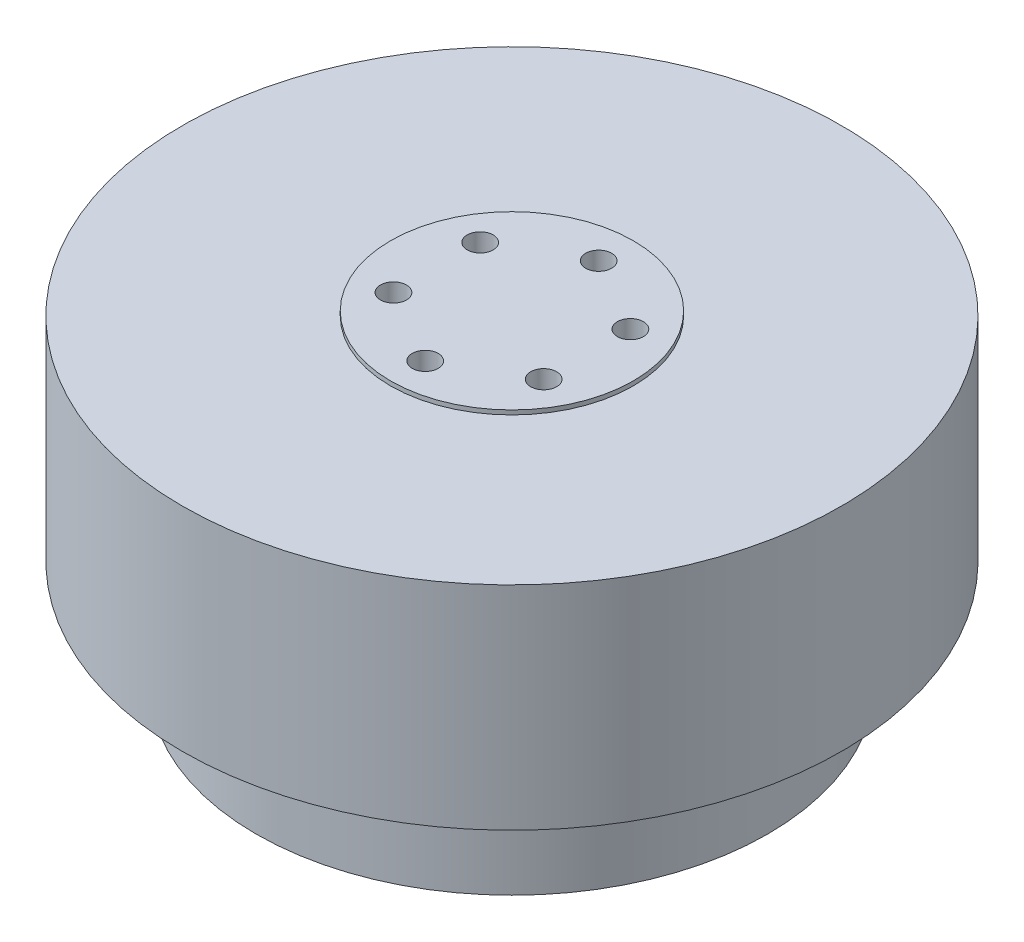
ISO-10303-21;
HEADER;
FILE_DESCRIPTION(('STEP AP214'),'2;1');
FILE_NAME('part.step','',(''),(''),'','','');
FILE_SCHEMA(('AUTOMOTIVE_DESIGN { 1 0 10303 214 1 1 1 1 }'));
ENDSEC;
DATA;
#1=APPLICATION_CONTEXT('core data for automotive mechanical design processes');
#2=APPLICATION_PROTOCOL_DEFINITION('international standard','automotive_design',2000,#1);
#3=PRODUCT_CONTEXT('',#1,'mechanical');
#4=PRODUCT('Part','Part','',(#3));
#5=PRODUCT_RELATED_PRODUCT_CATEGORY('part','',(#4));
#6=PRODUCT_DEFINITION_FORMATION('','',#4);
#7=PRODUCT_DEFINITION_CONTEXT('part definition',#1,'design');
#8=PRODUCT_DEFINITION('design','',#6,#7);
#9=PRODUCT_DEFINITION_SHAPE('','',#8);
#10=(LENGTH_UNIT() NAMED_UNIT(*) SI_UNIT(.MILLI.,.METRE.));
#11=(NAMED_UNIT(*) PLANE_ANGLE_UNIT() SI_UNIT($,.RADIAN.));
#12=(NAMED_UNIT(*) SI_UNIT($,.STERADIAN.) SOLID_ANGLE_UNIT());
#13=UNCERTAINTY_MEASURE_WITH_UNIT(LENGTH_MEASURE(1.E-05),#10,'distance_accuracy_value','');
#14=(GEOMETRIC_REPRESENTATION_CONTEXT(3) GLOBAL_UNCERTAINTY_ASSIGNED_CONTEXT((#13)) GLOBAL_UNIT_ASSIGNED_CONTEXT((#10,
#11,#12)) REPRESENTATION_CONTEXT('',''));
#15=CARTESIAN_POINT('',(0.,0.,0.));
#16=DIRECTION('',(0.,0.,1.));
#17=DIRECTION('',(1.,0.,0.));
#18=AXIS2_PLACEMENT_3D('',#15,#16,#17);
#19=CARTESIAN_POINT('',(0.,24.5,0.));
#20=DIRECTION('',(0.,-1.,0.));
#21=DIRECTION('',(0.,0.,-1.));
#22=AXIS2_PLACEMENT_3D('',#19,#20,#21);
#23=CYLINDRICAL_SURFACE('',#22,38.);
#24=CARTESIAN_POINT('',(0.,24.5,0.));
#25=DIRECTION('',(0.,1.,0.));
#26=DIRECTION('',(0.,0.,1.));
#27=AXIS2_PLACEMENT_3D('',#24,#25,#26);
#28=CIRCLE('',#27,38.);
#29=CARTESIAN_POINT('',(0.,24.5,38.));
#30=VERTEX_POINT('',#29);
#31=EDGE_CURVE('E46',#30,#30,#28,.T.);
#32=ORIENTED_EDGE('',*,*,#31,.F.);
#33=EDGE_LOOP('',(#32));
#34=FACE_BOUND('',#33,.T.);
#35=CARTESIAN_POINT('',(0.,0.,0.));
#36=DIRECTION('',(0.,1.,0.));
#37=DIRECTION('',(0.,0.,1.));
#38=AXIS2_PLACEMENT_3D('',#35,#36,#37);
#39=CIRCLE('',#38,38.);
#40=CARTESIAN_POINT('',(0.,0.,38.));
#41=VERTEX_POINT('',#40);
#42=EDGE_CURVE('E37',#41,#41,#39,.T.);
#43=ORIENTED_EDGE('',*,*,#42,.T.);
#44=EDGE_LOOP('',(#43));
#45=FACE_BOUND('',#44,.T.);
#46=ADVANCED_FACE('F34',(#34,#45),#23,.T.);
#47=CARTESIAN_POINT('',(0.,24.5,0.));
#48=DIRECTION('',(0.,1.,0.));
#49=DIRECTION('',(0.,0.,1.));
#50=AXIS2_PLACEMENT_3D('',#47,#48,#49);
#51=PLANE('',#50);
#52=CARTESIAN_POINT('',(0.,24.5,0.));
#53=DIRECTION('',(0.,1.,0.));
#54=DIRECTION('',(0.,0.,1.));
#55=AXIS2_PLACEMENT_3D('',#52,#53,#54);
#56=CIRCLE('',#55,14.);
#57=CARTESIAN_POINT('',(0.,24.5,14.));
#58=VERTEX_POINT('',#57);
#59=EDGE_CURVE('E41',#58,#58,#56,.T.);
#60=ORIENTED_EDGE('',*,*,#59,.F.);
#61=EDGE_LOOP('',(#60));
#62=FACE_BOUND('',#61,.T.);
#63=ORIENTED_EDGE('',*,*,#31,.T.);
#64=EDGE_LOOP('',(#63));
#65=FACE_BOUND('',#64,.T.);
#66=ADVANCED_FACE('F64',(#62,#65),#51,.T.);
#67=CARTESIAN_POINT('',(0.,0.,0.));
#68=DIRECTION('',(0.,1.,0.));
#69=DIRECTION('',(0.,0.,1.));
#70=AXIS2_PLACEMENT_3D('',#67,#68,#69);
#71=PLANE('',#70);
#72=CARTESIAN_POINT('',(0.,0.,34.));
#73=DIRECTION('',(0.,-1.,0.));
#74=DIRECTION('',(0.,0.,-1.));
#75=AXIS2_PLACEMENT_3D('',#72,#73,#74);
#76=CIRCLE('',#75,1.5);
#77=CARTESIAN_POINT('',(0.,0.,32.5));
#78=VERTEX_POINT('',#77);
#79=EDGE_CURVE('E372',#78,#78,#76,.T.);
#80=ORIENTED_EDGE('',*,*,#79,.F.);
#81=EDGE_LOOP('',(#80));
#82=FACE_BOUND('',#81,.T.);
#83=CARTESIAN_POINT('',(-29.4448637286697,0.,16.9999999999979));
#84=DIRECTION('',(0.,-1.,0.));
#85=DIRECTION('',(0.,0.,-1.));
#86=AXIS2_PLACEMENT_3D('',#83,#84,#85);
#87=CIRCLE('',#86,1.50000000000217);
#88=CARTESIAN_POINT('',(-29.4448637286697,0.,15.4999999999957));
#89=VERTEX_POINT('',#88);
#90=EDGE_CURVE('E385',#89,#89,#87,.T.);
#91=ORIENTED_EDGE('',*,*,#90,.F.);
#92=EDGE_LOOP('',(#91));
#93=FACE_BOUND('',#92,.T.);
#94=CARTESIAN_POINT('',(-29.4448637286673,0.,-17.0000000000021));
#95=DIRECTION('',(0.,-1.,0.));
#96=DIRECTION('',(0.,0.,-1.));
#97=AXIS2_PLACEMENT_3D('',#94,#95,#96);
#98=CIRCLE('',#97,1.50000000000438);
#99=CARTESIAN_POINT('',(-29.4448637286673,0.,-18.5000000000065));
#100=VERTEX_POINT('',#99);
#101=EDGE_CURVE('E384',#100,#100,#98,.T.);
#102=ORIENTED_EDGE('',*,*,#101,.F.);
#103=EDGE_LOOP('',(#102));
#104=FACE_BOUND('',#103,.T.);
#105=CARTESIAN_POINT('',(4.81919920581738E-12,0.,-34.));
#106=DIRECTION('',(0.,-1.,0.));
#107=DIRECTION('',(0.,0.,-1.));
#108=AXIS2_PLACEMENT_3D('',#105,#106,#107);
#109=CIRCLE('',#108,1.50000000000484);
#110=CARTESIAN_POINT('',(4.81919920581738E-12,0.,-35.5000000000048));
#111=VERTEX_POINT('',#110);
#112=EDGE_CURVE('E402',#111,#111,#109,.T.);
#113=ORIENTED_EDGE('',*,*,#112,.F.);
#114=EDGE_LOOP('',(#113));
#115=FACE_BOUND('',#114,.T.);
#116=CARTESIAN_POINT('',(29.4448637286745,0.,-16.9999999999979));
#117=DIRECTION('',(0.,-1.,0.));
#118=DIRECTION('',(0.,0.,-1.));
#119=AXIS2_PLACEMENT_3D('',#116,#117,#118);
#120=CIRCLE('',#119,1.500000000003);
#121=CARTESIAN_POINT('',(29.4448637286745,0.,-18.5000000000009));
#122=VERTEX_POINT('',#121);
#123=EDGE_CURVE('E396',#122,#122,#120,.T.);
#124=ORIENTED_EDGE('',*,*,#123,.F.);
#125=EDGE_LOOP('',(#124));
#126=FACE_BOUND('',#125,.T.);
#127=CARTESIAN_POINT('',(29.4448637286721,0.,17.0000000000021));
#128=DIRECTION('',(0.,-1.,0.));
#129=DIRECTION('',(0.,0.,-1.));
#130=AXIS2_PLACEMENT_3D('',#127,#128,#129);
#131=CIRCLE('',#130,1.50000000000063);
#132=CARTESIAN_POINT('',(29.4448637286721,0.,15.5000000000015));
#133=VERTEX_POINT('',#132);
#134=EDGE_CURVE('E390',#133,#133,#131,.T.);
#135=ORIENTED_EDGE('',*,*,#134,.F.);
#136=EDGE_LOOP('',(#135));
#137=FACE_BOUND('',#136,.T.);
#138=CARTESIAN_POINT('',(0.,0.,0.));
#139=DIRECTION('',(0.,-1.,0.));
#140=DIRECTION('',(0.,0.,-1.));
#141=AXIS2_PLACEMENT_3D('',#138,#139,#140);
#142=CIRCLE('',#141,29.5);
#143=CARTESIAN_POINT('',(0.,0.,-29.5));
#144=VERTEX_POINT('',#143);
#145=EDGE_CURVE('E10',#144,#144,#142,.T.);
#146=ORIENTED_EDGE('',*,*,#145,.F.);
#147=EDGE_LOOP('',(#146));
#148=FACE_BOUND('',#147,.T.);
#149=ORIENTED_EDGE('',*,*,#42,.F.);
#150=EDGE_LOOP('',(#149));
#151=FACE_BOUND('',#150,.T.);
#152=ADVANCED_FACE('F61',(#82,#93,#104,#115,#126,#137,#148,#151),#71,.F.);
#153=CARTESIAN_POINT('',(0.,25.,0.));
#154=DIRECTION('',(0.,-1.,0.));
#155=DIRECTION('',(0.,0.,-1.));
#156=AXIS2_PLACEMENT_3D('',#153,#154,#155);
#157=CYLINDRICAL_SURFACE('',#156,14.);
#158=CARTESIAN_POINT('',(0.,25.,0.));
#159=DIRECTION('',(0.,1.,0.));
#160=DIRECTION('',(0.,0.,1.));
#161=AXIS2_PLACEMENT_3D('',#158,#159,#160);
#162=CIRCLE('',#161,14.);
#163=CARTESIAN_POINT('',(0.,25.,14.));
#164=VERTEX_POINT('',#163);
#165=EDGE_CURVE('E52',#164,#164,#162,.T.);
#166=ORIENTED_EDGE('',*,*,#165,.F.);
#167=EDGE_LOOP('',(#166));
#168=FACE_BOUND('',#167,.T.);
#169=ORIENTED_EDGE('',*,*,#59,.T.);
#170=EDGE_LOOP('',(#169));
#171=FACE_BOUND('',#170,.T.);
#172=ADVANCED_FACE('F63',(#168,#171),#157,.T.);
#173=CARTESIAN_POINT('',(0.,25.,0.));
#174=DIRECTION('',(0.,1.,0.));
#175=DIRECTION('',(0.,0.,1.));
#176=AXIS2_PLACEMENT_3D('',#173,#174,#175);
#177=PLANE('',#176);
#178=CARTESIAN_POINT('',(0.,25.,-10.));
#179=DIRECTION('',(0.,1.,0.));
#180=DIRECTION('',(0.,0.,1.));
#181=AXIS2_PLACEMENT_3D('',#178,#179,#180);
#182=CIRCLE('',#181,1.5);
#183=CARTESIAN_POINT('',(0.,25.,-8.5));
#184=VERTEX_POINT('',#183);
#185=EDGE_CURVE('E413',#184,#184,#182,.T.);
#186=ORIENTED_EDGE('',*,*,#185,.F.);
#187=EDGE_LOOP('',(#186));
#188=FACE_BOUND('',#187,.T.);
#189=CARTESIAN_POINT('',(-8.66025403784418,25.,-4.99999999999963));
#190=DIRECTION('',(0.,1.,0.));
#191=DIRECTION('',(0.,0.,1.));
#192=AXIS2_PLACEMENT_3D('',#189,#190,#191);
#193=CIRCLE('',#192,1.50000000000043);
#194=CARTESIAN_POINT('',(-8.66025403784418,25.,-3.4999999999992));
#195=VERTEX_POINT('',#194);
#196=EDGE_CURVE('E371',#195,#195,#193,.T.);
#197=ORIENTED_EDGE('',*,*,#196,.F.);
#198=EDGE_LOOP('',(#197));
#199=FACE_BOUND('',#198,.T.);
#200=CARTESIAN_POINT('',(-8.66025403784375,25.,5.00000000000037));
#201=DIRECTION('',(0.,1.,0.));
#202=DIRECTION('',(0.,0.,1.));
#203=AXIS2_PLACEMENT_3D('',#200,#201,#202);
#204=CIRCLE('',#203,1.50000000000081);
#205=CARTESIAN_POINT('',(-8.66025403784375,25.,6.50000000000118));
#206=VERTEX_POINT('',#205);
#207=EDGE_CURVE('E418',#206,#206,#204,.T.);
#208=ORIENTED_EDGE('',*,*,#207,.F.);
#209=EDGE_LOOP('',(#208));
#210=FACE_BOUND('',#209,.T.);
#211=CARTESIAN_POINT('',(8.48977342514678E-13,25.,10.));
#212=DIRECTION('',(0.,1.,0.));
#213=DIRECTION('',(0.,0.,1.));
#214=AXIS2_PLACEMENT_3D('',#211,#212,#213);
#215=CIRCLE('',#214,1.50000000000088);
#216=CARTESIAN_POINT('',(8.48977342514678E-13,25.,11.5000000000009));
#217=VERTEX_POINT('',#216);
#218=EDGE_CURVE('E434',#217,#217,#215,.T.);
#219=ORIENTED_EDGE('',*,*,#218,.F.);
#220=EDGE_LOOP('',(#219));
#221=FACE_BOUND('',#220,.T.);
#222=CARTESIAN_POINT('',(8.66025403784503,25.,4.99999999999963));
#223=DIRECTION('',(0.,1.,0.));
#224=DIRECTION('',(0.,0.,1.));
#225=AXIS2_PLACEMENT_3D('',#222,#223,#224);
#226=CIRCLE('',#225,1.50000000000055);
#227=CARTESIAN_POINT('',(8.66025403784503,25.,6.50000000000018));
#228=VERTEX_POINT('',#227);
#229=EDGE_CURVE('E428',#228,#228,#226,.T.);
#230=ORIENTED_EDGE('',*,*,#229,.F.);
#231=EDGE_LOOP('',(#230));
#232=FACE_BOUND('',#231,.T.);
#233=CARTESIAN_POINT('',(8.6602540378446,25.,-5.00000000000037));
#234=DIRECTION('',(0.,1.,0.));
#235=DIRECTION('',(0.,0.,1.));
#236=AXIS2_PLACEMENT_3D('',#233,#234,#235);
#237=CIRCLE('',#236,1.50000000000012);
#238=CARTESIAN_POINT('',(8.6602540378446,25.,-3.50000000000025));
#239=VERTEX_POINT('',#238);
#240=EDGE_CURVE('E422',#239,#239,#237,.T.);
#241=ORIENTED_EDGE('',*,*,#240,.F.);
#242=EDGE_LOOP('',(#241));
#243=FACE_BOUND('',#242,.T.);
#244=ORIENTED_EDGE('',*,*,#165,.T.);
#245=EDGE_LOOP('',(#244));
#246=FACE_BOUND('',#245,.T.);
#247=ADVANCED_FACE('F70',(#188,#199,#210,#221,#232,#243,#246),#177,.T.);
#248=CARTESIAN_POINT('',(0.,-12.5,0.));
#249=DIRECTION('',(0.,1.,0.));
#250=DIRECTION('',(0.,0.,1.));
#251=AXIS2_PLACEMENT_3D('',#248,#249,#250);
#252=CYLINDRICAL_SURFACE('',#251,29.5);
#253=CARTESIAN_POINT('',(0.,-12.5,0.));
#254=DIRECTION('',(0.,-1.,0.));
#255=DIRECTION('',(0.,0.,-1.));
#256=AXIS2_PLACEMENT_3D('',#253,#254,#255);
#257=CIRCLE('',#256,29.5);
#258=CARTESIAN_POINT('',(0.,-12.5,-29.5));
#259=VERTEX_POINT('',#258);
#260=EDGE_CURVE('E50',#259,#259,#257,.T.);
#261=ORIENTED_EDGE('',*,*,#260,.F.);
#262=EDGE_LOOP('',(#261));
#263=FACE_BOUND('',#262,.T.);
#264=ORIENTED_EDGE('',*,*,#145,.T.);
#265=EDGE_LOOP('',(#264));
#266=FACE_BOUND('',#265,.T.);
#267=ADVANCED_FACE('F99',(#263,#266),#252,.T.);
#268=CARTESIAN_POINT('',(0.,-12.5,0.));
#269=DIRECTION('',(0.,-1.,0.));
#270=DIRECTION('',(0.,0.,-1.));
#271=AXIS2_PLACEMENT_3D('',#268,#269,#270);
#272=PLANE('',#271);
#273=ORIENTED_EDGE('',*,*,#260,.T.);
#274=EDGE_LOOP('',(#273));
#275=FACE_BOUND('',#274,.T.);
#276=ADVANCED_FACE('F104',(#275),#272,.T.);
#277=CARTESIAN_POINT('',(8.6602540378446,20.,-5.00000000000037));
#278=DIRECTION('',(0.,1.,0.));
#279=DIRECTION('',(0.,0.,1.));
#280=AXIS2_PLACEMENT_3D('',#277,#278,#279);
#281=CYLINDRICAL_SURFACE('',#280,1.50000000000012);
#282=CARTESIAN_POINT('',(8.6602540378446,20.,-5.00000000000037));
#283=DIRECTION('',(0.,1.,0.));
#284=DIRECTION('',(0.,0.,1.));
#285=AXIS2_PLACEMENT_3D('',#282,#283,#284);
#286=CIRCLE('',#285,1.50000000000012);
#287=CARTESIAN_POINT('',(8.6602540378446,20.,-3.50000000000025));
#288=VERTEX_POINT('',#287);
#289=EDGE_CURVE('E416',#288,#288,#286,.T.);
#290=ORIENTED_EDGE('',*,*,#289,.F.);
#291=EDGE_LOOP('',(#290));
#292=FACE_BOUND('',#291,.T.);
#293=ORIENTED_EDGE('',*,*,#240,.T.);
#294=EDGE_LOOP('',(#293));
#295=FACE_BOUND('',#294,.T.);
#296=ADVANCED_FACE('F114',(#292,#295),#281,.F.);
#297=CARTESIAN_POINT('',(8.6602540378446,20.,-5.00000000000037));
#298=DIRECTION('',(0.,1.,0.));
#299=DIRECTION('',(0.,0.,1.));
#300=AXIS2_PLACEMENT_3D('',#297,#298,#299);
#301=PLANE('',#300);
#302=ORIENTED_EDGE('',*,*,#289,.T.);
#303=EDGE_LOOP('',(#302));
#304=FACE_BOUND('',#303,.T.);
#305=ADVANCED_FACE('F131',(#304),#301,.T.);
#306=CARTESIAN_POINT('',(8.66025403784503,20.,4.99999999999963));
#307=DIRECTION('',(0.,1.,0.));
#308=DIRECTION('',(0.,0.,1.));
#309=AXIS2_PLACEMENT_3D('',#306,#307,#308);
#310=CYLINDRICAL_SURFACE('',#309,1.50000000000055);
#311=CARTESIAN_POINT('',(8.66025403784503,20.,4.99999999999963));
#312=DIRECTION('',(0.,1.,0.));
#313=DIRECTION('',(0.,0.,1.));
#314=AXIS2_PLACEMENT_3D('',#311,#312,#313);
#315=CIRCLE('',#314,1.50000000000055);
#316=CARTESIAN_POINT('',(8.66025403784503,20.,6.50000000000018));
#317=VERTEX_POINT('',#316);
#318=EDGE_CURVE('E425',#317,#317,#315,.T.);
#319=ORIENTED_EDGE('',*,*,#318,.F.);
#320=EDGE_LOOP('',(#319));
#321=FACE_BOUND('',#320,.T.);
#322=ORIENTED_EDGE('',*,*,#229,.T.);
#323=EDGE_LOOP('',(#322));
#324=FACE_BOUND('',#323,.T.);
#325=ADVANCED_FACE('F141',(#321,#324),#310,.F.);
#326=CARTESIAN_POINT('',(8.66025403784503,20.,4.99999999999963));
#327=DIRECTION('',(0.,1.,0.));
#328=DIRECTION('',(0.,0.,1.));
#329=AXIS2_PLACEMENT_3D('',#326,#327,#328);
#330=PLANE('',#329);
#331=ORIENTED_EDGE('',*,*,#318,.T.);
#332=EDGE_LOOP('',(#331));
#333=FACE_BOUND('',#332,.T.);
#334=ADVANCED_FACE('F151',(#333),#330,.T.);
#335=CARTESIAN_POINT('',(8.48977342514678E-13,20.,10.));
#336=DIRECTION('',(0.,1.,0.));
#337=DIRECTION('',(0.,0.,1.));
#338=AXIS2_PLACEMENT_3D('',#335,#336,#337);
#339=CYLINDRICAL_SURFACE('',#338,1.50000000000088);
#340=CARTESIAN_POINT('',(8.48977342514678E-13,20.,10.));
#341=DIRECTION('',(0.,1.,0.));
#342=DIRECTION('',(0.,0.,1.));
#343=AXIS2_PLACEMENT_3D('',#340,#341,#342);
#344=CIRCLE('',#343,1.50000000000088);
#345=CARTESIAN_POINT('',(8.48977342514678E-13,20.,11.5000000000009));
#346=VERTEX_POINT('',#345);
#347=EDGE_CURVE('E431',#346,#346,#344,.T.);
#348=ORIENTED_EDGE('',*,*,#347,.F.);
#349=EDGE_LOOP('',(#348));
#350=FACE_BOUND('',#349,.T.);
#351=ORIENTED_EDGE('',*,*,#218,.T.);
#352=EDGE_LOOP('',(#351));
#353=FACE_BOUND('',#352,.T.);
#354=ADVANCED_FACE('F161',(#350,#353),#339,.F.);
#355=CARTESIAN_POINT('',(8.48977342514678E-13,20.,10.));
#356=DIRECTION('',(0.,1.,0.));
#357=DIRECTION('',(0.,0.,1.));
#358=AXIS2_PLACEMENT_3D('',#355,#356,#357);
#359=PLANE('',#358);
#360=ORIENTED_EDGE('',*,*,#347,.T.);
#361=EDGE_LOOP('',(#360));
#362=FACE_BOUND('',#361,.T.);
#363=ADVANCED_FACE('F171',(#362),#359,.T.);
#364=CARTESIAN_POINT('',(-8.66025403784375,20.,5.00000000000037));
#365=DIRECTION('',(0.,1.,0.));
#366=DIRECTION('',(0.,0.,1.));
#367=AXIS2_PLACEMENT_3D('',#364,#365,#366);
#368=CYLINDRICAL_SURFACE('',#367,1.50000000000081);
#369=CARTESIAN_POINT('',(-8.66025403784375,20.,5.00000000000037));
#370=DIRECTION('',(0.,1.,0.));
#371=DIRECTION('',(0.,0.,1.));
#372=AXIS2_PLACEMENT_3D('',#369,#370,#371);
#373=CIRCLE('',#372,1.50000000000081);
#374=CARTESIAN_POINT('',(-8.66025403784375,20.,6.50000000000118));
#375=VERTEX_POINT('',#374);
#376=EDGE_CURVE('E437',#375,#375,#373,.T.);
#377=ORIENTED_EDGE('',*,*,#376,.F.);
#378=EDGE_LOOP('',(#377));
#379=FACE_BOUND('',#378,.T.);
#380=ORIENTED_EDGE('',*,*,#207,.T.);
#381=EDGE_LOOP('',(#380));
#382=FACE_BOUND('',#381,.T.);
#383=ADVANCED_FACE('F181',(#379,#382),#368,.F.);
#384=CARTESIAN_POINT('',(-8.66025403784375,20.,5.00000000000037));
#385=DIRECTION('',(0.,1.,0.));
#386=DIRECTION('',(0.,0.,1.));
#387=AXIS2_PLACEMENT_3D('',#384,#385,#386);
#388=PLANE('',#387);
#389=ORIENTED_EDGE('',*,*,#376,.T.);
#390=EDGE_LOOP('',(#389));
#391=FACE_BOUND('',#390,.T.);
#392=ADVANCED_FACE('F191',(#391),#388,.T.);
#393=CARTESIAN_POINT('',(-8.66025403784418,20.,-4.99999999999963));
#394=DIRECTION('',(0.,1.,0.));
#395=DIRECTION('',(0.,0.,1.));
#396=AXIS2_PLACEMENT_3D('',#393,#394,#395);
#397=CYLINDRICAL_SURFACE('',#396,1.50000000000043);
#398=CARTESIAN_POINT('',(-8.66025403784418,20.,-4.99999999999963));
#399=DIRECTION('',(0.,1.,0.));
#400=DIRECTION('',(0.,0.,1.));
#401=AXIS2_PLACEMENT_3D('',#398,#399,#400);
#402=CIRCLE('',#401,1.50000000000043);
#403=CARTESIAN_POINT('',(-8.66025403784418,20.,-3.4999999999992));
#404=VERTEX_POINT('',#403);
#405=EDGE_CURVE('E375',#404,#404,#402,.T.);
#406=ORIENTED_EDGE('',*,*,#405,.F.);
#407=EDGE_LOOP('',(#406));
#408=FACE_BOUND('',#407,.T.);
#409=ORIENTED_EDGE('',*,*,#196,.T.);
#410=EDGE_LOOP('',(#409));
#411=FACE_BOUND('',#410,.T.);
#412=ADVANCED_FACE('F201',(#408,#411),#397,.F.);
#413=CARTESIAN_POINT('',(-8.66025403784418,20.,-4.99999999999963));
#414=DIRECTION('',(0.,1.,0.));
#415=DIRECTION('',(0.,0.,1.));
#416=AXIS2_PLACEMENT_3D('',#413,#414,#415);
#417=PLANE('',#416);
#418=ORIENTED_EDGE('',*,*,#405,.T.);
#419=EDGE_LOOP('',(#418));
#420=FACE_BOUND('',#419,.T.);
#421=ADVANCED_FACE('F211',(#420),#417,.T.);
#422=CARTESIAN_POINT('',(0.,20.,-10.));
#423=DIRECTION('',(0.,1.,0.));
#424=DIRECTION('',(0.,0.,1.));
#425=AXIS2_PLACEMENT_3D('',#422,#423,#424);
#426=CYLINDRICAL_SURFACE('',#425,1.5);
#427=CARTESIAN_POINT('',(0.,20.,-10.));
#428=DIRECTION('',(0.,1.,0.));
#429=DIRECTION('',(0.,0.,1.));
#430=AXIS2_PLACEMENT_3D('',#427,#428,#429);
#431=CIRCLE('',#430,1.5);
#432=CARTESIAN_POINT('',(0.,20.,-8.5));
#433=VERTEX_POINT('',#432);
#434=EDGE_CURVE('E410',#433,#433,#431,.T.);
#435=ORIENTED_EDGE('',*,*,#434,.F.);
#436=EDGE_LOOP('',(#435));
#437=FACE_BOUND('',#436,.T.);
#438=ORIENTED_EDGE('',*,*,#185,.T.);
#439=EDGE_LOOP('',(#438));
#440=FACE_BOUND('',#439,.T.);
#441=ADVANCED_FACE('F221',(#437,#440),#426,.F.);
#442=CARTESIAN_POINT('',(0.,20.,-10.));
#443=DIRECTION('',(0.,1.,0.));
#444=DIRECTION('',(0.,0.,1.));
#445=AXIS2_PLACEMENT_3D('',#442,#443,#444);
#446=PLANE('',#445);
#447=ORIENTED_EDGE('',*,*,#434,.T.);
#448=EDGE_LOOP('',(#447));
#449=FACE_BOUND('',#448,.T.);
#450=ADVANCED_FACE('F231',(#449),#446,.T.);
#451=CARTESIAN_POINT('',(29.4448637286721,3.,17.0000000000021));
#452=DIRECTION('',(0.,-1.,0.));
#453=DIRECTION('',(0.,0.,-1.));
#454=AXIS2_PLACEMENT_3D('',#451,#452,#453);
#455=CYLINDRICAL_SURFACE('',#454,1.50000000000063);
#456=CARTESIAN_POINT('',(29.4448637286721,3.,17.0000000000021));
#457=DIRECTION('',(0.,-1.,0.));
#458=DIRECTION('',(0.,0.,-1.));
#459=AXIS2_PLACEMENT_3D('',#456,#457,#458);
#460=CIRCLE('',#459,1.50000000000063);
#461=CARTESIAN_POINT('',(29.4448637286721,3.,15.5000000000015));
#462=VERTEX_POINT('',#461);
#463=EDGE_CURVE('E378',#462,#462,#460,.T.);
#464=ORIENTED_EDGE('',*,*,#463,.F.);
#465=EDGE_LOOP('',(#464));
#466=FACE_BOUND('',#465,.T.);
#467=ORIENTED_EDGE('',*,*,#134,.T.);
#468=EDGE_LOOP('',(#467));
#469=FACE_BOUND('',#468,.T.);
#470=ADVANCED_FACE('F240',(#466,#469),#455,.F.);
#471=CARTESIAN_POINT('',(29.4448637286721,3.,17.0000000000021));
#472=DIRECTION('',(0.,-1.,0.));
#473=DIRECTION('',(0.,0.,-1.));
#474=AXIS2_PLACEMENT_3D('',#471,#472,#473);
#475=PLANE('',#474);
#476=ORIENTED_EDGE('',*,*,#463,.T.);
#477=EDGE_LOOP('',(#476));
#478=FACE_BOUND('',#477,.T.);
#479=ADVANCED_FACE('F254',(#478),#475,.T.);
#480=CARTESIAN_POINT('',(29.4448637286745,3.,-16.9999999999979));
#481=DIRECTION('',(0.,-1.,0.));
#482=DIRECTION('',(0.,0.,-1.));
#483=AXIS2_PLACEMENT_3D('',#480,#481,#482);
#484=CYLINDRICAL_SURFACE('',#483,1.500000000003);
#485=CARTESIAN_POINT('',(29.4448637286745,3.,-16.9999999999979));
#486=DIRECTION('',(0.,-1.,0.));
#487=DIRECTION('',(0.,0.,-1.));
#488=AXIS2_PLACEMENT_3D('',#485,#486,#487);
#489=CIRCLE('',#488,1.500000000003);
#490=CARTESIAN_POINT('',(29.4448637286745,3.,-18.5000000000009));
#491=VERTEX_POINT('',#490);
#492=EDGE_CURVE('E393',#491,#491,#489,.T.);
#493=ORIENTED_EDGE('',*,*,#492,.F.);
#494=EDGE_LOOP('',(#493));
#495=FACE_BOUND('',#494,.T.);
#496=ORIENTED_EDGE('',*,*,#123,.T.);
#497=EDGE_LOOP('',(#496));
#498=FACE_BOUND('',#497,.T.);
#499=ADVANCED_FACE('F264',(#495,#498),#484,.F.);
#500=CARTESIAN_POINT('',(29.4448637286745,3.,-16.9999999999979));
#501=DIRECTION('',(0.,-1.,0.));
#502=DIRECTION('',(0.,0.,-1.));
#503=AXIS2_PLACEMENT_3D('',#500,#501,#502);
#504=PLANE('',#503);
#505=ORIENTED_EDGE('',*,*,#492,.T.);
#506=EDGE_LOOP('',(#505));
#507=FACE_BOUND('',#506,.T.);
#508=ADVANCED_FACE('F274',(#507),#504,.T.);
#509=CARTESIAN_POINT('',(4.81919920581738E-12,3.,-34.));
#510=DIRECTION('',(0.,-1.,0.));
#511=DIRECTION('',(0.,0.,-1.));
#512=AXIS2_PLACEMENT_3D('',#509,#510,#511);
#513=CYLINDRICAL_SURFACE('',#512,1.50000000000484);
#514=CARTESIAN_POINT('',(4.81919920581738E-12,3.,-34.));
#515=DIRECTION('',(0.,-1.,0.));
#516=DIRECTION('',(0.,0.,-1.));
#517=AXIS2_PLACEMENT_3D('',#514,#515,#516);
#518=CIRCLE('',#517,1.50000000000484);
#519=CARTESIAN_POINT('',(4.81919920581738E-12,3.,-35.5000000000048));
#520=VERTEX_POINT('',#519);
#521=EDGE_CURVE('E399',#520,#520,#518,.T.);
#522=ORIENTED_EDGE('',*,*,#521,.F.);
#523=EDGE_LOOP('',(#522));
#524=FACE_BOUND('',#523,.T.);
#525=ORIENTED_EDGE('',*,*,#112,.T.);
#526=EDGE_LOOP('',(#525));
#527=FACE_BOUND('',#526,.T.);
#528=ADVANCED_FACE('F284',(#524,#527),#513,.F.);
#529=CARTESIAN_POINT('',(4.81919920581738E-12,3.,-34.));
#530=DIRECTION('',(0.,-1.,0.));
#531=DIRECTION('',(0.,0.,-1.));
#532=AXIS2_PLACEMENT_3D('',#529,#530,#531);
#533=PLANE('',#532);
#534=ORIENTED_EDGE('',*,*,#521,.T.);
#535=EDGE_LOOP('',(#534));
#536=FACE_BOUND('',#535,.T.);
#537=ADVANCED_FACE('F294',(#536),#533,.T.);
#538=CARTESIAN_POINT('',(-29.4448637286673,3.,-17.0000000000021));
#539=DIRECTION('',(0.,-1.,0.));
#540=DIRECTION('',(0.,0.,-1.));
#541=AXIS2_PLACEMENT_3D('',#538,#539,#540);
#542=CYLINDRICAL_SURFACE('',#541,1.50000000000438);
#543=CARTESIAN_POINT('',(-29.4448637286673,3.,-17.0000000000021));
#544=DIRECTION('',(0.,-1.,0.));
#545=DIRECTION('',(0.,0.,-1.));
#546=AXIS2_PLACEMENT_3D('',#543,#544,#545);
#547=CIRCLE('',#546,1.50000000000438);
#548=CARTESIAN_POINT('',(-29.4448637286673,3.,-18.5000000000065));
#549=VERTEX_POINT('',#548);
#550=EDGE_CURVE('E405',#549,#549,#547,.T.);
#551=ORIENTED_EDGE('',*,*,#550,.F.);
#552=EDGE_LOOP('',(#551));
#553=FACE_BOUND('',#552,.T.);
#554=ORIENTED_EDGE('',*,*,#101,.T.);
#555=EDGE_LOOP('',(#554));
#556=FACE_BOUND('',#555,.T.);
#557=ADVANCED_FACE('F304',(#553,#556),#542,.F.);
#558=CARTESIAN_POINT('',(-29.4448637286673,3.,-17.0000000000021));
#559=DIRECTION('',(0.,-1.,0.));
#560=DIRECTION('',(0.,0.,-1.));
#561=AXIS2_PLACEMENT_3D('',#558,#559,#560);
#562=PLANE('',#561);
#563=ORIENTED_EDGE('',*,*,#550,.T.);
#564=EDGE_LOOP('',(#563));
#565=FACE_BOUND('',#564,.T.);
#566=ADVANCED_FACE('F314',(#565),#562,.T.);
#567=CARTESIAN_POINT('',(-29.4448637286697,3.,16.9999999999979));
#568=DIRECTION('',(0.,-1.,0.));
#569=DIRECTION('',(0.,0.,-1.));
#570=AXIS2_PLACEMENT_3D('',#567,#568,#569);
#571=CYLINDRICAL_SURFACE('',#570,1.50000000000217);
#572=CARTESIAN_POINT('',(-29.4448637286697,3.,16.9999999999979));
#573=DIRECTION('',(0.,-1.,0.));
#574=DIRECTION('',(0.,0.,-1.));
#575=AXIS2_PLACEMENT_3D('',#572,#573,#574);
#576=CIRCLE('',#575,1.50000000000217);
#577=CARTESIAN_POINT('',(-29.4448637286697,3.,15.4999999999957));
#578=VERTEX_POINT('',#577);
#579=EDGE_CURVE('E381',#578,#578,#576,.T.);
#580=ORIENTED_EDGE('',*,*,#579,.F.);
#581=EDGE_LOOP('',(#580));
#582=FACE_BOUND('',#581,.T.);
#583=ORIENTED_EDGE('',*,*,#90,.T.);
#584=EDGE_LOOP('',(#583));
#585=FACE_BOUND('',#584,.T.);
#586=ADVANCED_FACE('F324',(#582,#585),#571,.F.);
#587=CARTESIAN_POINT('',(-29.4448637286697,3.,16.9999999999979));
#588=DIRECTION('',(0.,-1.,0.));
#589=DIRECTION('',(0.,0.,-1.));
#590=AXIS2_PLACEMENT_3D('',#587,#588,#589);
#591=PLANE('',#590);
#592=ORIENTED_EDGE('',*,*,#579,.T.);
#593=EDGE_LOOP('',(#592));
#594=FACE_BOUND('',#593,.T.);
#595=ADVANCED_FACE('F334',(#594),#591,.T.);
#596=CARTESIAN_POINT('',(0.,3.,34.));
#597=DIRECTION('',(0.,-1.,0.));
#598=DIRECTION('',(0.,0.,-1.));
#599=AXIS2_PLACEMENT_3D('',#596,#597,#598);
#600=CYLINDRICAL_SURFACE('',#599,1.5);
#601=CARTESIAN_POINT('',(0.,3.,34.));
#602=DIRECTION('',(0.,-1.,0.));
#603=DIRECTION('',(0.,0.,-1.));
#604=AXIS2_PLACEMENT_3D('',#601,#602,#603);
#605=CIRCLE('',#604,1.5);
#606=CARTESIAN_POINT('',(0.,3.,32.5));
#607=VERTEX_POINT('',#606);
#608=EDGE_CURVE('E370',#607,#607,#605,.T.);
#609=ORIENTED_EDGE('',*,*,#608,.F.);
#610=EDGE_LOOP('',(#609));
#611=FACE_BOUND('',#610,.T.);
#612=ORIENTED_EDGE('',*,*,#79,.T.);
#613=EDGE_LOOP('',(#612));
#614=FACE_BOUND('',#613,.T.);
#615=ADVANCED_FACE('F344',(#611,#614),#600,.F.);
#616=CARTESIAN_POINT('',(0.,3.,34.));
#617=DIRECTION('',(0.,-1.,0.));
#618=DIRECTION('',(0.,0.,-1.));
#619=AXIS2_PLACEMENT_3D('',#616,#617,#618);
#620=PLANE('',#619);
#621=ORIENTED_EDGE('',*,*,#608,.T.);
#622=EDGE_LOOP('',(#621));
#623=FACE_BOUND('',#622,.T.);
#624=ADVANCED_FACE('F354',(#623),#620,.T.);
#625=CLOSED_SHELL('',(#46,#66,#152,#172,#247,#267,#276,#296,#305,#325,#334,#354,#363,#383,#392,
#412,#421,#441,#450,#470,#479,#499,#508,#528,#537,#557,#566,#586,#595,#615,#624));
#626=MANIFOLD_SOLID_BREP('B2',#625);
#627=ADVANCED_BREP_SHAPE_REPRESENTATION('',(#18,#626),#14);
#628=SHAPE_DEFINITION_REPRESENTATION(#9,#627);
ENDSEC;
END-ISO-10303-21;
